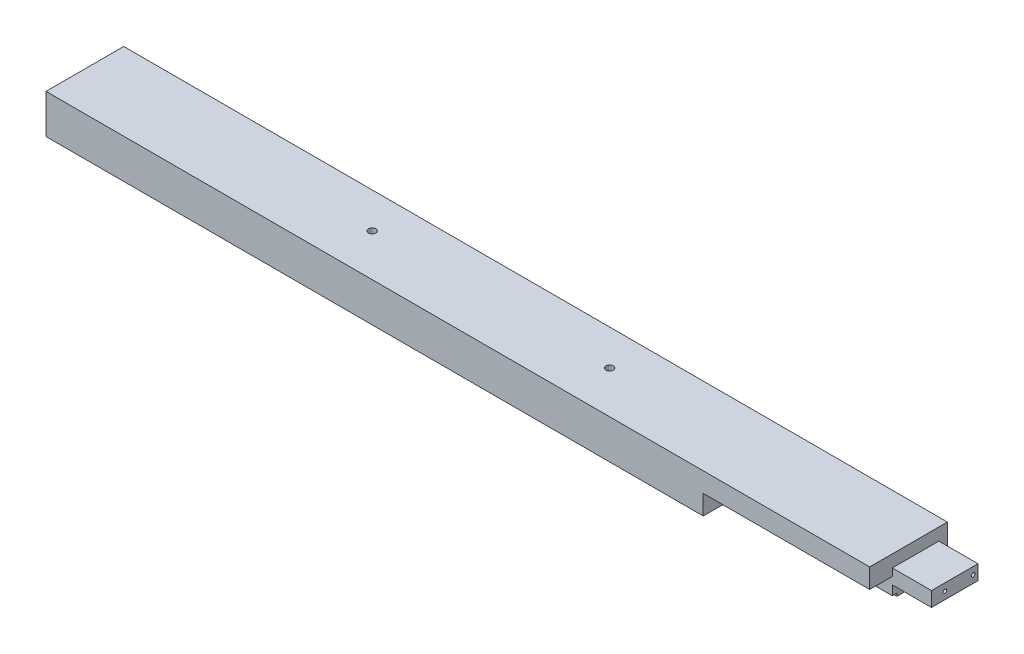
ISO-10303-21;
HEADER;
FILE_DESCRIPTION(('STEP AP214'),'2;1');
FILE_NAME('part.step','',(''),(''),'','','');
FILE_SCHEMA(('AUTOMOTIVE_DESIGN { 1 0 10303 214 1 1 1 1 }'));
ENDSEC;
DATA;
#1=APPLICATION_CONTEXT('core data for automotive mechanical design processes');
#2=APPLICATION_PROTOCOL_DEFINITION('international standard','automotive_design',2000,#1);
#3=PRODUCT_CONTEXT('',#1,'mechanical');
#4=PRODUCT('Part','Part','',(#3));
#5=PRODUCT_RELATED_PRODUCT_CATEGORY('part','',(#4));
#6=PRODUCT_DEFINITION_FORMATION('','',#4);
#7=PRODUCT_DEFINITION_CONTEXT('part definition',#1,'design');
#8=PRODUCT_DEFINITION('design','',#6,#7);
#9=PRODUCT_DEFINITION_SHAPE('','',#8);
#10=(LENGTH_UNIT() NAMED_UNIT(*) SI_UNIT(.MILLI.,.METRE.));
#11=(NAMED_UNIT(*) PLANE_ANGLE_UNIT() SI_UNIT($,.RADIAN.));
#12=(NAMED_UNIT(*) SI_UNIT($,.STERADIAN.) SOLID_ANGLE_UNIT());
#13=UNCERTAINTY_MEASURE_WITH_UNIT(LENGTH_MEASURE(1.E-05),#10,'distance_accuracy_value','');
#14=(GEOMETRIC_REPRESENTATION_CONTEXT(3) GLOBAL_UNCERTAINTY_ASSIGNED_CONTEXT((#13)) GLOBAL_UNIT_ASSIGNED_CONTEXT((#10,
#11,#12)) REPRESENTATION_CONTEXT('',''));
#15=CARTESIAN_POINT('',(0.,0.,0.));
#16=DIRECTION('',(0.,0.,1.));
#17=DIRECTION('',(1.,0.,0.));
#18=AXIS2_PLACEMENT_3D('',#15,#16,#17);
#19=CARTESIAN_POINT('',(1068.3875,101.6,100.80625));
#20=DIRECTION('',(0.,0.,-1.));
#21=DIRECTION('',(-1.,0.,0.));
#22=AXIS2_PLACEMENT_3D('',#19,#20,#21);
#23=PLANE('',#22);
#24=DIRECTION('',(1.,0.,0.));
#25=VECTOR('',#24,1.);
#26=CARTESIAN_POINT('',(636.5875,50.8,100.80625));
#27=LINE('',#26,#25);
#28=CARTESIAN_POINT('',(636.5875,50.8,100.80625));
#29=VERTEX_POINT('',#28);
#30=CARTESIAN_POINT('',(1068.3875,50.8,100.80625));
#31=VERTEX_POINT('',#30);
#32=EDGE_CURVE('E177',#29,#31,#27,.T.);
#33=ORIENTED_EDGE('',*,*,#32,.T.);
#34=DIRECTION('',(0.,-1.,0.));
#35=VECTOR('',#34,1.);
#36=CARTESIAN_POINT('',(1068.3875,101.6,100.80625));
#37=LINE('',#36,#35);
#38=CARTESIAN_POINT('',(1068.3875,101.6,100.80625));
#39=VERTEX_POINT('',#38);
#40=EDGE_CURVE('E43',#39,#31,#37,.T.);
#41=ORIENTED_EDGE('',*,*,#40,.F.);
#42=DIRECTION('',(1.,0.,0.));
#43=VECTOR('',#42,1.);
#44=CARTESIAN_POINT('',(1068.3875,101.6,100.80625));
#45=LINE('',#44,#43);
#46=CARTESIAN_POINT('',(-1068.3875,101.6,100.80625));
#47=VERTEX_POINT('',#46);
#48=EDGE_CURVE('E238',#47,#39,#45,.T.);
#49=ORIENTED_EDGE('',*,*,#48,.F.);
#50=DIRECTION('',(0.,-1.,0.));
#51=VECTOR('',#50,1.);
#52=CARTESIAN_POINT('',(-1068.3875,101.6,100.80625));
#53=LINE('',#52,#51);
#54=CARTESIAN_POINT('',(-1068.3875,0.,100.80625));
#55=VERTEX_POINT('',#54);
#56=EDGE_CURVE('E11',#47,#55,#53,.T.);
#57=ORIENTED_EDGE('',*,*,#56,.T.);
#58=DIRECTION('',(1.,0.,0.));
#59=VECTOR('',#58,1.);
#60=CARTESIAN_POINT('',(1068.3875,0.,100.80625));
#61=LINE('',#60,#59);
#62=CARTESIAN_POINT('',(636.5875,0.,100.80625));
#63=VERTEX_POINT('',#62);
#64=EDGE_CURVE('E248',#55,#63,#61,.T.);
#65=ORIENTED_EDGE('',*,*,#64,.T.);
#66=DIRECTION('',(0.,-1.,0.));
#67=VECTOR('',#66,1.);
#68=CARTESIAN_POINT('',(636.5875,0.,100.80625));
#69=LINE('',#68,#67);
#70=EDGE_CURVE('E165',#29,#63,#69,.T.);
#71=ORIENTED_EDGE('',*,*,#70,.F.);
#72=EDGE_LOOP('',(#33,#41,#49,#57,#65,#71));
#73=FACE_BOUND('',#72,.T.);
#74=ADVANCED_FACE('F35',(#73),#23,.F.);
#75=CARTESIAN_POINT('',(1068.3875,101.6,-100.80625));
#76=DIRECTION('',(-1.,0.,0.));
#77=DIRECTION('',(0.,0.,1.));
#78=AXIS2_PLACEMENT_3D('',#75,#76,#77);
#79=PLANE('',#78);
#80=DIRECTION('',(0.,0.,-1.));
#81=VECTOR('',#80,1.);
#82=CARTESIAN_POINT('',(1068.3875,50.8,0.));
#83=LINE('',#82,#81);
#84=CARTESIAN_POINT('',(1068.3875,50.8,42.0687499999999));
#85=VERTEX_POINT('',#84);
#86=EDGE_CURVE('E154',#31,#85,#83,.T.);
#87=ORIENTED_EDGE('',*,*,#86,.T.);
#88=DIRECTION('',(0.,-1.,0.));
#89=VECTOR('',#88,1.);
#90=CARTESIAN_POINT('',(1068.3875,0.,42.0687499999999));
#91=LINE('',#90,#89);
#92=CARTESIAN_POINT('',(1068.3875,69.85,42.0687499999999));
#93=VERTEX_POINT('',#92);
#94=EDGE_CURVE('E55',#93,#85,#91,.T.);
#95=ORIENTED_EDGE('',*,*,#94,.F.);
#96=DIRECTION('',(0.,0.,-1.));
#97=VECTOR('',#96,1.);
#98=CARTESIAN_POINT('',(1068.3875,69.85,0.));
#99=LINE('',#98,#97);
#100=CARTESIAN_POINT('',(1068.3875,69.85,-78.5812500000001));
#101=VERTEX_POINT('',#100);
#102=EDGE_CURVE('E50',#93,#101,#99,.T.);
#103=ORIENTED_EDGE('',*,*,#102,.T.);
#104=DIRECTION('',(0.,-1.,0.));
#105=VECTOR('',#104,1.);
#106=CARTESIAN_POINT('',(1068.3875,0.,-78.5812500000001));
#107=LINE('',#106,#105);
#108=CARTESIAN_POINT('',(1068.3875,31.75,-78.5812500000001));
#109=VERTEX_POINT('',#108);
#110=EDGE_CURVE('E207',#101,#109,#107,.T.);
#111=ORIENTED_EDGE('',*,*,#110,.T.);
#112=DIRECTION('',(0.,0.,-1.));
#113=VECTOR('',#112,1.);
#114=CARTESIAN_POINT('',(1068.3875,31.75,0.));
#115=LINE('',#114,#113);
#116=CARTESIAN_POINT('',(1068.3875,31.75,42.0687499999999));
#117=VERTEX_POINT('',#116);
#118=EDGE_CURVE('E187',#117,#109,#115,.T.);
#119=ORIENTED_EDGE('',*,*,#118,.F.);
#120=DIRECTION('',(0.,-1.,0.));
#121=VECTOR('',#120,1.);
#122=CARTESIAN_POINT('',(1068.3875,0.,42.0687499999999));
#123=LINE('',#122,#121);
#124=CARTESIAN_POINT('',(1068.3875,7.31225573473628,42.0687499999999));
#125=VERTEX_POINT('',#124);
#126=EDGE_CURVE('E156',#117,#125,#123,.T.);
#127=ORIENTED_EDGE('',*,*,#126,.T.);
#128=DIRECTION('',(0.,0.,-1.));
#129=VECTOR('',#128,1.);
#130=CARTESIAN_POINT('',(1068.3875,7.31225573473628,0.));
#131=LINE('',#130,#129);
#132=CARTESIAN_POINT('',(1068.3875,7.31225573473628,29.9320150234657));
#133=VERTEX_POINT('',#132);
#134=EDGE_CURVE('E169',#125,#133,#131,.T.);
#135=ORIENTED_EDGE('',*,*,#134,.T.);
#136=DIRECTION('',(0.,-1.,0.));
#137=VECTOR('',#136,1.);
#138=CARTESIAN_POINT('',(1068.3875,0.,29.9320150234657));
#139=LINE('',#138,#137);
#140=CARTESIAN_POINT('',(1068.3875,0.,29.9320150234657));
#141=VERTEX_POINT('',#140);
#142=EDGE_CURVE('E147',#133,#141,#139,.T.);
#143=ORIENTED_EDGE('',*,*,#142,.T.);
#144=DIRECTION('',(0.,0.,-1.));
#145=VECTOR('',#144,1.);
#146=CARTESIAN_POINT('',(1068.3875,0.,-100.80625));
#147=LINE('',#146,#145);
#148=CARTESIAN_POINT('',(1068.3875,0.,-100.80625));
#149=VERTEX_POINT('',#148);
#150=EDGE_CURVE('E251',#141,#149,#147,.T.);
#151=ORIENTED_EDGE('',*,*,#150,.T.);
#152=DIRECTION('',(0.,-1.,0.));
#153=VECTOR('',#152,1.);
#154=CARTESIAN_POINT('',(1068.3875,101.6,-100.80625));
#155=LINE('',#154,#153);
#156=CARTESIAN_POINT('',(1068.3875,101.6,-100.80625));
#157=VERTEX_POINT('',#156);
#158=EDGE_CURVE('E256',#157,#149,#155,.T.);
#159=ORIENTED_EDGE('',*,*,#158,.F.);
#160=DIRECTION('',(0.,0.,-1.));
#161=VECTOR('',#160,1.);
#162=CARTESIAN_POINT('',(1068.3875,101.6,-100.80625));
#163=LINE('',#162,#161);
#164=EDGE_CURVE('E241',#39,#157,#163,.T.);
#165=ORIENTED_EDGE('',*,*,#164,.F.);
#166=ORIENTED_EDGE('',*,*,#40,.T.);
#167=EDGE_LOOP('',(#87,#95,#103,#111,#119,#127,#135,#143,#151,#159,#165,#166));
#168=FACE_BOUND('',#167,.T.);
#169=ADVANCED_FACE('F261',(#168),#79,.F.);
#170=CARTESIAN_POINT('',(0.,0.,0.));
#171=DIRECTION('',(0.,-1.,0.));
#172=DIRECTION('',(0.,0.,-1.));
#173=AXIS2_PLACEMENT_3D('',#170,#171,#172);
#174=PLANE('',#173);
#175=CARTESIAN_POINT('',(1009.30668495334,0.,-65.8812500000001));
#176=DIRECTION('',(0.,-1.,0.));
#177=DIRECTION('',(0.,0.,-1.));
#178=AXIS2_PLACEMENT_3D('',#175,#176,#177);
#179=CIRCLE('',#178,11.1125000000001);
#180=CARTESIAN_POINT('',(1009.30668495334,0.,-76.9937500000001));
#181=VERTEX_POINT('',#180);
#182=EDGE_CURVE('E444',#181,#181,#179,.T.);
#183=ORIENTED_EDGE('',*,*,#182,.F.);
#184=EDGE_LOOP('',(#183));
#185=FACE_BOUND('',#184,.T.);
#186=CARTESIAN_POINT('',(1009.30668495334,0.,7.14374999999991));
#187=DIRECTION('',(0.,-1.,0.));
#188=DIRECTION('',(0.,0.,-1.));
#189=AXIS2_PLACEMENT_3D('',#186,#187,#188);
#190=CIRCLE('',#189,11.1125000000001);
#191=CARTESIAN_POINT('',(1009.30668495334,0.,-3.96875000000016));
#192=VERTEX_POINT('',#191);
#193=EDGE_CURVE('E159',#192,#192,#190,.T.);
#194=ORIENTED_EDGE('',*,*,#193,.F.);
#195=EDGE_LOOP('',(#194));
#196=FACE_BOUND('',#195,.T.);
#197=CARTESIAN_POINT('',(284.1625,0.,-8.73125000000026));
#198=DIRECTION('',(0.,1.,0.));
#199=DIRECTION('',(0.,0.,1.));
#200=AXIS2_PLACEMENT_3D('',#197,#198,#199);
#201=CIRCLE('',#200,9.52500000000002);
#202=CARTESIAN_POINT('',(284.1625,0.,0.793749999999762));
#203=VERTEX_POINT('',#202);
#204=EDGE_CURVE('E223',#203,#203,#201,.T.);
#205=ORIENTED_EDGE('',*,*,#204,.T.);
#206=EDGE_LOOP('',(#205));
#207=FACE_BOUND('',#206,.T.);
#208=CARTESIAN_POINT('',(-331.7875,0.,-8.73125000000008));
#209=DIRECTION('',(0.,1.,0.));
#210=DIRECTION('',(0.,0.,1.));
#211=AXIS2_PLACEMENT_3D('',#208,#209,#210);
#212=CIRCLE('',#211,9.52500000000002);
#213=CARTESIAN_POINT('',(-331.7875,0.,0.793749999999942));
#214=VERTEX_POINT('',#213);
#215=EDGE_CURVE('E229',#214,#214,#212,.T.);
#216=ORIENTED_EDGE('',*,*,#215,.T.);
#217=EDGE_LOOP('',(#216));
#218=FACE_BOUND('',#217,.T.);
#219=ORIENTED_EDGE('',*,*,#150,.F.);
#220=DIRECTION('',(1.,0.,0.));
#221=VECTOR('',#220,1.);
#222=CARTESIAN_POINT('',(636.5875,0.,29.9320150234657));
#223=LINE('',#222,#221);
#224=CARTESIAN_POINT('',(636.5875,0.,29.9320150234657));
#225=VERTEX_POINT('',#224);
#226=EDGE_CURVE('E174',#225,#141,#223,.T.);
#227=ORIENTED_EDGE('',*,*,#226,.F.);
#228=DIRECTION('',(0.,0.,-1.));
#229=VECTOR('',#228,1.);
#230=CARTESIAN_POINT('',(636.5875,0.,0.));
#231=LINE('',#230,#229);
#232=EDGE_CURVE('E149',#63,#225,#231,.T.);
#233=ORIENTED_EDGE('',*,*,#232,.F.);
#234=ORIENTED_EDGE('',*,*,#64,.F.);
#235=DIRECTION('',(0.,0.,1.));
#236=VECTOR('',#235,1.);
#237=CARTESIAN_POINT('',(-1068.3875,0.,-100.80625));
#238=LINE('',#237,#236);
#239=CARTESIAN_POINT('',(-1068.3875,0.,-100.80625));
#240=VERTEX_POINT('',#239);
#241=EDGE_CURVE('E232',#240,#55,#238,.T.);
#242=ORIENTED_EDGE('',*,*,#241,.F.);
#243=DIRECTION('',(-1.,0.,0.));
#244=VECTOR('',#243,1.);
#245=CARTESIAN_POINT('',(1068.3875,0.,-100.80625));
#246=LINE('',#245,#244);
#247=EDGE_CURVE('E239',#149,#240,#246,.T.);
#248=ORIENTED_EDGE('',*,*,#247,.F.);
#249=EDGE_LOOP('',(#219,#227,#233,#234,#242,#248));
#250=FACE_BOUND('',#249,.T.);
#251=ADVANCED_FACE('F306',(#185,#196,#207,#218,#250),#174,.T.);
#252=CARTESIAN_POINT('',(-1068.3875,101.6,-100.80625));
#253=DIRECTION('',(1.,0.,0.));
#254=DIRECTION('',(0.,0.,-1.));
#255=AXIS2_PLACEMENT_3D('',#252,#253,#254);
#256=PLANE('',#255);
#257=ORIENTED_EDGE('',*,*,#241,.T.);
#258=ORIENTED_EDGE('',*,*,#56,.F.);
#259=DIRECTION('',(0.,0.,1.));
#260=VECTOR('',#259,1.);
#261=CARTESIAN_POINT('',(-1068.3875,101.6,-100.80625));
#262=LINE('',#261,#260);
#263=CARTESIAN_POINT('',(-1068.3875,101.6,-100.80625));
#264=VERTEX_POINT('',#263);
#265=EDGE_CURVE('E235',#264,#47,#262,.T.);
#266=ORIENTED_EDGE('',*,*,#265,.F.);
#267=DIRECTION('',(0.,-1.,0.));
#268=VECTOR('',#267,1.);
#269=CARTESIAN_POINT('',(-1068.3875,101.6,-100.80625));
#270=LINE('',#269,#268);
#271=EDGE_CURVE('E245',#264,#240,#270,.T.);
#272=ORIENTED_EDGE('',*,*,#271,.T.);
#273=EDGE_LOOP('',(#257,#258,#266,#272));
#274=FACE_BOUND('',#273,.T.);
#275=ADVANCED_FACE('F37',(#274),#256,.F.);
#276=CARTESIAN_POINT('',(1068.3875,101.6,-100.80625));
#277=DIRECTION('',(0.,0.,1.));
#278=DIRECTION('',(1.,0.,0.));
#279=AXIS2_PLACEMENT_3D('',#276,#277,#278);
#280=PLANE('',#279);
#281=ORIENTED_EDGE('',*,*,#247,.T.);
#282=ORIENTED_EDGE('',*,*,#271,.F.);
#283=DIRECTION('',(-1.,0.,0.));
#284=VECTOR('',#283,1.);
#285=CARTESIAN_POINT('',(1068.3875,101.6,-100.80625));
#286=LINE('',#285,#284);
#287=EDGE_CURVE('E243',#157,#264,#286,.T.);
#288=ORIENTED_EDGE('',*,*,#287,.F.);
#289=ORIENTED_EDGE('',*,*,#158,.T.);
#290=EDGE_LOOP('',(#281,#282,#288,#289));
#291=FACE_BOUND('',#290,.T.);
#292=ADVANCED_FACE('F308',(#291),#280,.F.);
#293=CARTESIAN_POINT('',(0.,101.6,0.));
#294=DIRECTION('',(0.,-1.,0.));
#295=DIRECTION('',(0.,0.,-1.));
#296=AXIS2_PLACEMENT_3D('',#293,#294,#295);
#297=PLANE('',#296);
#298=CARTESIAN_POINT('',(284.1625,101.6,-8.73125000000026));
#299=DIRECTION('',(0.,1.,0.));
#300=DIRECTION('',(0.,0.,1.));
#301=AXIS2_PLACEMENT_3D('',#298,#299,#300);
#302=CIRCLE('',#301,9.52500000000002);
#303=CARTESIAN_POINT('',(284.1625,101.6,0.793749999999762));
#304=VERTEX_POINT('',#303);
#305=EDGE_CURVE('E222',#304,#304,#302,.T.);
#306=ORIENTED_EDGE('',*,*,#305,.F.);
#307=EDGE_LOOP('',(#306));
#308=FACE_BOUND('',#307,.T.);
#309=CARTESIAN_POINT('',(-331.7875,101.6,-8.73125000000008));
#310=DIRECTION('',(0.,1.,0.));
#311=DIRECTION('',(0.,0.,1.));
#312=AXIS2_PLACEMENT_3D('',#309,#310,#311);
#313=CIRCLE('',#312,9.52500000000002);
#314=CARTESIAN_POINT('',(-331.7875,101.6,0.793749999999942));
#315=VERTEX_POINT('',#314);
#316=EDGE_CURVE('E226',#315,#315,#313,.T.);
#317=ORIENTED_EDGE('',*,*,#316,.F.);
#318=EDGE_LOOP('',(#317));
#319=FACE_BOUND('',#318,.T.);
#320=ORIENTED_EDGE('',*,*,#265,.T.);
#321=ORIENTED_EDGE('',*,*,#48,.T.);
#322=ORIENTED_EDGE('',*,*,#164,.T.);
#323=ORIENTED_EDGE('',*,*,#287,.T.);
#324=EDGE_LOOP('',(#320,#321,#322,#323));
#325=FACE_BOUND('',#324,.T.);
#326=ADVANCED_FACE('F311',(#308,#319,#325),#297,.F.);
#327=CARTESIAN_POINT('',(-331.7875,0.,-8.73125000000008));
#328=DIRECTION('',(0.,1.,0.));
#329=DIRECTION('',(0.,0.,1.));
#330=AXIS2_PLACEMENT_3D('',#327,#328,#329);
#331=CYLINDRICAL_SURFACE('',#330,9.52500000000002);
#332=ORIENTED_EDGE('',*,*,#215,.F.);
#333=EDGE_LOOP('',(#332));
#334=FACE_BOUND('',#333,.T.);
#335=ORIENTED_EDGE('',*,*,#316,.T.);
#336=EDGE_LOOP('',(#335));
#337=FACE_BOUND('',#336,.T.);
#338=ADVANCED_FACE('F318',(#334,#337),#331,.F.);
#339=CARTESIAN_POINT('',(284.1625,0.,-8.73125000000026));
#340=DIRECTION('',(0.,1.,0.));
#341=DIRECTION('',(0.,0.,1.));
#342=AXIS2_PLACEMENT_3D('',#339,#340,#341);
#343=CYLINDRICAL_SURFACE('',#342,9.52500000000002);
#344=ORIENTED_EDGE('',*,*,#204,.F.);
#345=EDGE_LOOP('',(#344));
#346=FACE_BOUND('',#345,.T.);
#347=ORIENTED_EDGE('',*,*,#305,.T.);
#348=EDGE_LOOP('',(#347));
#349=FACE_BOUND('',#348,.T.);
#350=ADVANCED_FACE('F322',(#346,#349),#343,.F.);
#351=CARTESIAN_POINT('',(1169.9875,0.,-78.5812500000001));
#352=DIRECTION('',(0.,0.,-1.));
#353=DIRECTION('',(-1.,0.,0.));
#354=AXIS2_PLACEMENT_3D('',#351,#352,#353);
#355=PLANE('',#354);
#356=ORIENTED_EDGE('',*,*,#110,.F.);
#357=DIRECTION('',(-1.,0.,0.));
#358=VECTOR('',#357,1.);
#359=CARTESIAN_POINT('',(1169.9875,69.85,-78.5812500000001));
#360=LINE('',#359,#358);
#361=CARTESIAN_POINT('',(1169.9875,69.85,-78.5812500000001));
#362=VERTEX_POINT('',#361);
#363=EDGE_CURVE('E220',#362,#101,#360,.T.);
#364=ORIENTED_EDGE('',*,*,#363,.F.);
#365=DIRECTION('',(0.,-1.,0.));
#366=VECTOR('',#365,1.);
#367=CARTESIAN_POINT('',(1169.9875,0.,-78.5812500000001));
#368=LINE('',#367,#366);
#369=CARTESIAN_POINT('',(1169.9875,31.75,-78.5812500000001));
#370=VERTEX_POINT('',#369);
#371=EDGE_CURVE('E190',#362,#370,#368,.T.);
#372=ORIENTED_EDGE('',*,*,#371,.T.);
#373=DIRECTION('',(-1.,0.,0.));
#374=VECTOR('',#373,1.);
#375=CARTESIAN_POINT('',(1169.9875,31.75,-78.5812500000001));
#376=LINE('',#375,#374);
#377=EDGE_CURVE('E201',#370,#109,#376,.T.);
#378=ORIENTED_EDGE('',*,*,#377,.T.);
#379=EDGE_LOOP('',(#356,#364,#372,#378));
#380=FACE_BOUND('',#379,.T.);
#381=ADVANCED_FACE('F279',(#380),#355,.T.);
#382=CARTESIAN_POINT('',(1169.9875,69.85,0.));
#383=DIRECTION('',(0.,1.,0.));
#384=DIRECTION('',(0.,0.,1.));
#385=AXIS2_PLACEMENT_3D('',#382,#383,#384);
#386=PLANE('',#385);
#387=ORIENTED_EDGE('',*,*,#102,.F.);
#388=DIRECTION('',(-1.,0.,0.));
#389=VECTOR('',#388,1.);
#390=CARTESIAN_POINT('',(1169.9875,69.85,42.0687499999999));
#391=LINE('',#390,#389);
#392=CARTESIAN_POINT('',(1169.9875,69.85,42.0687499999999));
#393=VERTEX_POINT('',#392);
#394=EDGE_CURVE('E218',#393,#93,#391,.T.);
#395=ORIENTED_EDGE('',*,*,#394,.F.);
#396=DIRECTION('',(0.,0.,-1.));
#397=VECTOR('',#396,1.);
#398=CARTESIAN_POINT('',(1169.9875,69.85,0.));
#399=LINE('',#398,#397);
#400=EDGE_CURVE('E193',#393,#362,#399,.T.);
#401=ORIENTED_EDGE('',*,*,#400,.T.);
#402=ORIENTED_EDGE('',*,*,#363,.T.);
#403=EDGE_LOOP('',(#387,#395,#401,#402));
#404=FACE_BOUND('',#403,.T.);
#405=ADVANCED_FACE('F275',(#404),#386,.T.);
#406=CARTESIAN_POINT('',(1169.9875,0.,42.0687499999999));
#407=DIRECTION('',(0.,0.,-1.));
#408=DIRECTION('',(0.,1.,0.));
#409=AXIS2_PLACEMENT_3D('',#406,#407,#408);
#410=PLANE('',#409);
#411=ORIENTED_EDGE('',*,*,#94,.T.);
#412=DIRECTION('',(1.,0.,0.));
#413=VECTOR('',#412,1.);
#414=CARTESIAN_POINT('',(636.5875,50.8,42.0687499999999));
#415=LINE('',#414,#413);
#416=CARTESIAN_POINT('',(636.5875,50.8,42.0687499999999));
#417=VERTEX_POINT('',#416);
#418=EDGE_CURVE('E180',#417,#85,#415,.T.);
#419=ORIENTED_EDGE('',*,*,#418,.F.);
#420=DIRECTION('',(0.,-1.,0.));
#421=VECTOR('',#420,1.);
#422=CARTESIAN_POINT('',(636.5875,0.,42.0687499999999));
#423=LINE('',#422,#421);
#424=CARTESIAN_POINT('',(636.5875,7.31225573473628,42.0687499999999));
#425=VERTEX_POINT('',#424);
#426=EDGE_CURVE('E140',#417,#425,#423,.T.);
#427=ORIENTED_EDGE('',*,*,#426,.T.);
#428=DIRECTION('',(1.,0.,0.));
#429=VECTOR('',#428,1.);
#430=CARTESIAN_POINT('',(636.5875,7.31225573473628,42.0687499999999));
#431=LINE('',#430,#429);
#432=EDGE_CURVE('E136',#425,#125,#431,.T.);
#433=ORIENTED_EDGE('',*,*,#432,.T.);
#434=ORIENTED_EDGE('',*,*,#126,.F.);
#435=DIRECTION('',(-1.,0.,0.));
#436=VECTOR('',#435,1.);
#437=CARTESIAN_POINT('',(1169.9875,31.75,42.0687499999999));
#438=LINE('',#437,#436);
#439=CARTESIAN_POINT('',(1169.9875,31.75,42.0687499999999));
#440=VERTEX_POINT('',#439);
#441=EDGE_CURVE('E215',#440,#117,#438,.T.);
#442=ORIENTED_EDGE('',*,*,#441,.F.);
#443=DIRECTION('',(0.,-1.,0.));
#444=VECTOR('',#443,1.);
#445=CARTESIAN_POINT('',(1169.9875,0.,42.0687499999999));
#446=LINE('',#445,#444);
#447=EDGE_CURVE('E196',#393,#440,#446,.T.);
#448=ORIENTED_EDGE('',*,*,#447,.F.);
#449=ORIENTED_EDGE('',*,*,#394,.T.);
#450=EDGE_LOOP('',(#411,#419,#427,#433,#434,#442,#448,#449));
#451=FACE_BOUND('',#450,.T.);
#452=ADVANCED_FACE('F270',(#451),#410,.F.);
#453=CARTESIAN_POINT('',(1169.9875,50.8,-65.8812500000001));
#454=DIRECTION('',(-1.,0.,0.));
#455=DIRECTION('',(0.,0.,1.));
#456=AXIS2_PLACEMENT_3D('',#453,#454,#455);
#457=CYLINDRICAL_SURFACE('',#456,4.7625);
#458=CARTESIAN_POINT('',(1169.9875,50.8,-65.8812500000001));
#459=DIRECTION('',(1.,0.,0.));
#460=DIRECTION('',(0.,0.,-1.));
#461=AXIS2_PLACEMENT_3D('',#458,#459,#460);
#462=CIRCLE('',#461,4.7625);
#463=CARTESIAN_POINT('',(1169.9875,50.8,-70.6437500000001));
#464=VERTEX_POINT('',#463);
#465=EDGE_CURVE('E186',#464,#464,#462,.T.);
#466=ORIENTED_EDGE('',*,*,#465,.T.);
#467=EDGE_LOOP('',(#466));
#468=FACE_BOUND('',#467,.T.);
#469=CARTESIAN_POINT('',(1068.3875,50.8,-65.8812500000001));
#470=DIRECTION('',(1.,0.,0.));
#471=DIRECTION('',(0.,0.,-1.));
#472=AXIS2_PLACEMENT_3D('',#469,#470,#471);
#473=CIRCLE('',#472,4.7625);
#474=CARTESIAN_POINT('',(1068.3875,50.8,-70.6437500000001));
#475=VERTEX_POINT('',#474);
#476=EDGE_CURVE('E204',#475,#475,#473,.T.);
#477=ORIENTED_EDGE('',*,*,#476,.F.);
#478=EDGE_LOOP('',(#477));
#479=FACE_BOUND('',#478,.T.);
#480=ADVANCED_FACE('F329',(#468,#479),#457,.F.);
#481=CARTESIAN_POINT('',(1169.9875,50.8,7.14374999999991));
#482=DIRECTION('',(-1.,0.,0.));
#483=DIRECTION('',(0.,0.,1.));
#484=AXIS2_PLACEMENT_3D('',#481,#482,#483);
#485=CYLINDRICAL_SURFACE('',#484,4.7625);
#486=CARTESIAN_POINT('',(1169.9875,50.8,7.14374999999991));
#487=DIRECTION('',(1.,0.,0.));
#488=DIRECTION('',(0.,0.,-1.));
#489=AXIS2_PLACEMENT_3D('',#486,#487,#488);
#490=CIRCLE('',#489,4.7625);
#491=CARTESIAN_POINT('',(1169.9875,50.8,2.38124999999991));
#492=VERTEX_POINT('',#491);
#493=EDGE_CURVE('E183',#492,#492,#490,.T.);
#494=ORIENTED_EDGE('',*,*,#493,.T.);
#495=EDGE_LOOP('',(#494));
#496=FACE_BOUND('',#495,.T.);
#497=CARTESIAN_POINT('',(1068.3875,50.8,7.14374999999991));
#498=DIRECTION('',(1.,0.,0.));
#499=DIRECTION('',(0.,0.,-1.));
#500=AXIS2_PLACEMENT_3D('',#497,#498,#499);
#501=CIRCLE('',#500,4.7625);
#502=CARTESIAN_POINT('',(1068.3875,50.8,2.38124999999991));
#503=VERTEX_POINT('',#502);
#504=EDGE_CURVE('E176',#503,#503,#501,.T.);
#505=ORIENTED_EDGE('',*,*,#504,.F.);
#506=EDGE_LOOP('',(#505));
#507=FACE_BOUND('',#506,.T.);
#508=ADVANCED_FACE('F297',(#496,#507),#485,.F.);
#509=CARTESIAN_POINT('',(1169.9875,31.75,0.));
#510=DIRECTION('',(0.,1.,0.));
#511=DIRECTION('',(0.,0.,1.));
#512=AXIS2_PLACEMENT_3D('',#509,#510,#511);
#513=PLANE('',#512);
#514=ORIENTED_EDGE('',*,*,#118,.T.);
#515=ORIENTED_EDGE('',*,*,#377,.F.);
#516=DIRECTION('',(0.,0.,-1.));
#517=VECTOR('',#516,1.);
#518=CARTESIAN_POINT('',(1169.9875,31.75,0.));
#519=LINE('',#518,#517);
#520=EDGE_CURVE('E199',#440,#370,#519,.T.);
#521=ORIENTED_EDGE('',*,*,#520,.F.);
#522=ORIENTED_EDGE('',*,*,#441,.T.);
#523=EDGE_LOOP('',(#514,#515,#521,#522));
#524=FACE_BOUND('',#523,.T.);
#525=ADVANCED_FACE('F283',(#524),#513,.F.);
#526=CARTESIAN_POINT('',(1169.9875,0.,0.));
#527=DIRECTION('',(1.,0.,0.));
#528=DIRECTION('',(0.,0.,-1.));
#529=AXIS2_PLACEMENT_3D('',#526,#527,#528);
#530=PLANE('',#529);
#531=ORIENTED_EDGE('',*,*,#493,.F.);
#532=EDGE_LOOP('',(#531));
#533=FACE_BOUND('',#532,.T.);
#534=ORIENTED_EDGE('',*,*,#465,.F.);
#535=EDGE_LOOP('',(#534));
#536=FACE_BOUND('',#535,.T.);
#537=ORIENTED_EDGE('',*,*,#371,.F.);
#538=ORIENTED_EDGE('',*,*,#400,.F.);
#539=ORIENTED_EDGE('',*,*,#447,.T.);
#540=ORIENTED_EDGE('',*,*,#520,.T.);
#541=EDGE_LOOP('',(#537,#538,#539,#540));
#542=FACE_BOUND('',#541,.T.);
#543=ADVANCED_FACE('F285',(#533,#536,#542),#530,.T.);
#544=ORIENTED_EDGE('',*,*,#504,.T.);
#545=EDGE_LOOP('',(#544));
#546=FACE_BOUND('',#545,.T.);
#547=ADVANCED_FACE('F287',(#546),#79,.F.);
#548=ORIENTED_EDGE('',*,*,#476,.T.);
#549=EDGE_LOOP('',(#548));
#550=FACE_BOUND('',#549,.T.);
#551=ADVANCED_FACE('F294',(#550),#79,.F.);
#552=CARTESIAN_POINT('',(636.5875,0.,29.9320150234657));
#553=DIRECTION('',(0.,0.,1.));
#554=DIRECTION('',(1.,0.,0.));
#555=AXIS2_PLACEMENT_3D('',#552,#553,#554);
#556=PLANE('',#555);
#557=ORIENTED_EDGE('',*,*,#142,.F.);
#558=DIRECTION('',(1.,0.,0.));
#559=VECTOR('',#558,1.);
#560=CARTESIAN_POINT('',(636.5875,7.31225573473628,29.9320150234657));
#561=LINE('',#560,#559);
#562=CARTESIAN_POINT('',(636.5875,7.31225573473628,29.9320150234657));
#563=VERTEX_POINT('',#562);
#564=EDGE_CURVE('E134',#563,#133,#561,.T.);
#565=ORIENTED_EDGE('',*,*,#564,.F.);
#566=DIRECTION('',(0.,-1.,0.));
#567=VECTOR('',#566,1.);
#568=CARTESIAN_POINT('',(636.5875,0.,29.9320150234657));
#569=LINE('',#568,#567);
#570=EDGE_CURVE('E141',#563,#225,#569,.T.);
#571=ORIENTED_EDGE('',*,*,#570,.T.);
#572=ORIENTED_EDGE('',*,*,#226,.T.);
#573=EDGE_LOOP('',(#557,#565,#571,#572));
#574=FACE_BOUND('',#573,.T.);
#575=ADVANCED_FACE('F144',(#574),#556,.T.);
#576=CARTESIAN_POINT('',(636.5875,50.8,0.));
#577=DIRECTION('',(0.,-1.,0.));
#578=DIRECTION('',(0.,0.,-1.));
#579=AXIS2_PLACEMENT_3D('',#576,#577,#578);
#580=PLANE('',#579);
#581=ORIENTED_EDGE('',*,*,#86,.F.);
#582=ORIENTED_EDGE('',*,*,#32,.F.);
#583=DIRECTION('',(0.,0.,-1.));
#584=VECTOR('',#583,1.);
#585=CARTESIAN_POINT('',(636.5875,50.8,0.));
#586=LINE('',#585,#584);
#587=EDGE_CURVE('E163',#29,#417,#586,.T.);
#588=ORIENTED_EDGE('',*,*,#587,.T.);
#589=ORIENTED_EDGE('',*,*,#418,.T.);
#590=EDGE_LOOP('',(#581,#582,#588,#589));
#591=FACE_BOUND('',#590,.T.);
#592=ADVANCED_FACE('F267',(#591),#580,.T.);
#593=CARTESIAN_POINT('',(636.5875,7.31225573473628,0.));
#594=DIRECTION('',(0.,-1.,0.));
#595=DIRECTION('',(0.,0.,-1.));
#596=AXIS2_PLACEMENT_3D('',#593,#594,#595);
#597=PLANE('',#596);
#598=ORIENTED_EDGE('',*,*,#134,.F.);
#599=ORIENTED_EDGE('',*,*,#432,.F.);
#600=DIRECTION('',(0.,0.,-1.));
#601=VECTOR('',#600,1.);
#602=CARTESIAN_POINT('',(636.5875,7.31225573473628,0.));
#603=LINE('',#602,#601);
#604=EDGE_CURVE('E130',#425,#563,#603,.T.);
#605=ORIENTED_EDGE('',*,*,#604,.T.);
#606=ORIENTED_EDGE('',*,*,#564,.T.);
#607=EDGE_LOOP('',(#598,#599,#605,#606));
#608=FACE_BOUND('',#607,.T.);
#609=ADVANCED_FACE('F133',(#608),#597,.T.);
#610=CARTESIAN_POINT('',(636.5875,0.,0.));
#611=DIRECTION('',(1.,0.,0.));
#612=DIRECTION('',(0.,0.,-1.));
#613=AXIS2_PLACEMENT_3D('',#610,#611,#612);
#614=PLANE('',#613);
#615=ORIENTED_EDGE('',*,*,#570,.F.);
#616=ORIENTED_EDGE('',*,*,#604,.F.);
#617=ORIENTED_EDGE('',*,*,#426,.F.);
#618=ORIENTED_EDGE('',*,*,#587,.F.);
#619=ORIENTED_EDGE('',*,*,#70,.T.);
#620=ORIENTED_EDGE('',*,*,#232,.T.);
#621=EDGE_LOOP('',(#615,#616,#617,#618,#619,#620));
#622=FACE_BOUND('',#621,.T.);
#623=ADVANCED_FACE('F151',(#622),#614,.T.);
#624=CARTESIAN_POINT('',(1009.30668495334,69.85,7.14374999999991));
#625=DIRECTION('',(0.,-1.,0.));
#626=DIRECTION('',(0.,0.,-1.));
#627=AXIS2_PLACEMENT_3D('',#624,#625,#626);
#628=CYLINDRICAL_SURFACE('',#627,11.1125000000001);
#629=CARTESIAN_POINT('',(1009.30668495334,69.85,7.14374999999991));
#630=DIRECTION('',(0.,-1.,0.));
#631=DIRECTION('',(0.,0.,-1.));
#632=AXIS2_PLACEMENT_3D('',#629,#630,#631);
#633=CIRCLE('',#632,11.1125000000001);
#634=CARTESIAN_POINT('',(1009.30668495334,69.85,-3.96875000000016));
#635=VERTEX_POINT('',#634);
#636=EDGE_CURVE('E170',#635,#635,#633,.T.);
#637=ORIENTED_EDGE('',*,*,#636,.F.);
#638=EDGE_LOOP('',(#637));
#639=FACE_BOUND('',#638,.T.);
#640=ORIENTED_EDGE('',*,*,#193,.T.);
#641=EDGE_LOOP('',(#640));
#642=FACE_BOUND('',#641,.T.);
#643=ADVANCED_FACE('F390',(#639,#642),#628,.F.);
#644=CARTESIAN_POINT('',(1009.30668495334,69.85,7.14374999999991));
#645=DIRECTION('',(0.,-1.,0.));
#646=DIRECTION('',(0.,0.,-1.));
#647=AXIS2_PLACEMENT_3D('',#644,#645,#646);
#648=PLANE('',#647);
#649=ORIENTED_EDGE('',*,*,#636,.T.);
#650=EDGE_LOOP('',(#649));
#651=FACE_BOUND('',#650,.T.);
#652=ADVANCED_FACE('F407',(#651),#648,.T.);
#653=CARTESIAN_POINT('',(1009.30668495334,69.85,-65.8812500000001));
#654=DIRECTION('',(0.,-1.,0.));
#655=DIRECTION('',(0.,0.,-1.));
#656=AXIS2_PLACEMENT_3D('',#653,#654,#655);
#657=CYLINDRICAL_SURFACE('',#656,11.1125000000001);
#658=CARTESIAN_POINT('',(1009.30668495334,69.85,-65.8812500000001));
#659=DIRECTION('',(0.,-1.,0.));
#660=DIRECTION('',(0.,0.,-1.));
#661=AXIS2_PLACEMENT_3D('',#658,#659,#660);
#662=CIRCLE('',#661,11.1125000000001);
#663=CARTESIAN_POINT('',(1009.30668495334,69.85,-76.9937500000001));
#664=VERTEX_POINT('',#663);
#665=EDGE_CURVE('E443',#664,#664,#662,.T.);
#666=ORIENTED_EDGE('',*,*,#665,.F.);
#667=EDGE_LOOP('',(#666));
#668=FACE_BOUND('',#667,.T.);
#669=ORIENTED_EDGE('',*,*,#182,.T.);
#670=EDGE_LOOP('',(#669));
#671=FACE_BOUND('',#670,.T.);
#672=ADVANCED_FACE('F417',(#668,#671),#657,.F.);
#673=CARTESIAN_POINT('',(1009.30668495334,69.85,-65.8812500000001));
#674=DIRECTION('',(0.,-1.,0.));
#675=DIRECTION('',(0.,0.,-1.));
#676=AXIS2_PLACEMENT_3D('',#673,#674,#675);
#677=PLANE('',#676);
#678=ORIENTED_EDGE('',*,*,#665,.T.);
#679=EDGE_LOOP('',(#678));
#680=FACE_BOUND('',#679,.T.);
#681=ADVANCED_FACE('F427',(#680),#677,.T.);
#682=CLOSED_SHELL('',(#74,#169,#251,#275,#292,#326,#338,#350,#381,#405,#452,#480,#508,#525,#543,
#547,#551,#575,#592,#609,#623,#643,#652,#672,#681));
#683=MANIFOLD_SOLID_BREP('B2',#682);
#684=ADVANCED_BREP_SHAPE_REPRESENTATION('',(#18,#683),#14);
#685=SHAPE_DEFINITION_REPRESENTATION(#9,#684);
ENDSEC;
END-ISO-10303-21;
